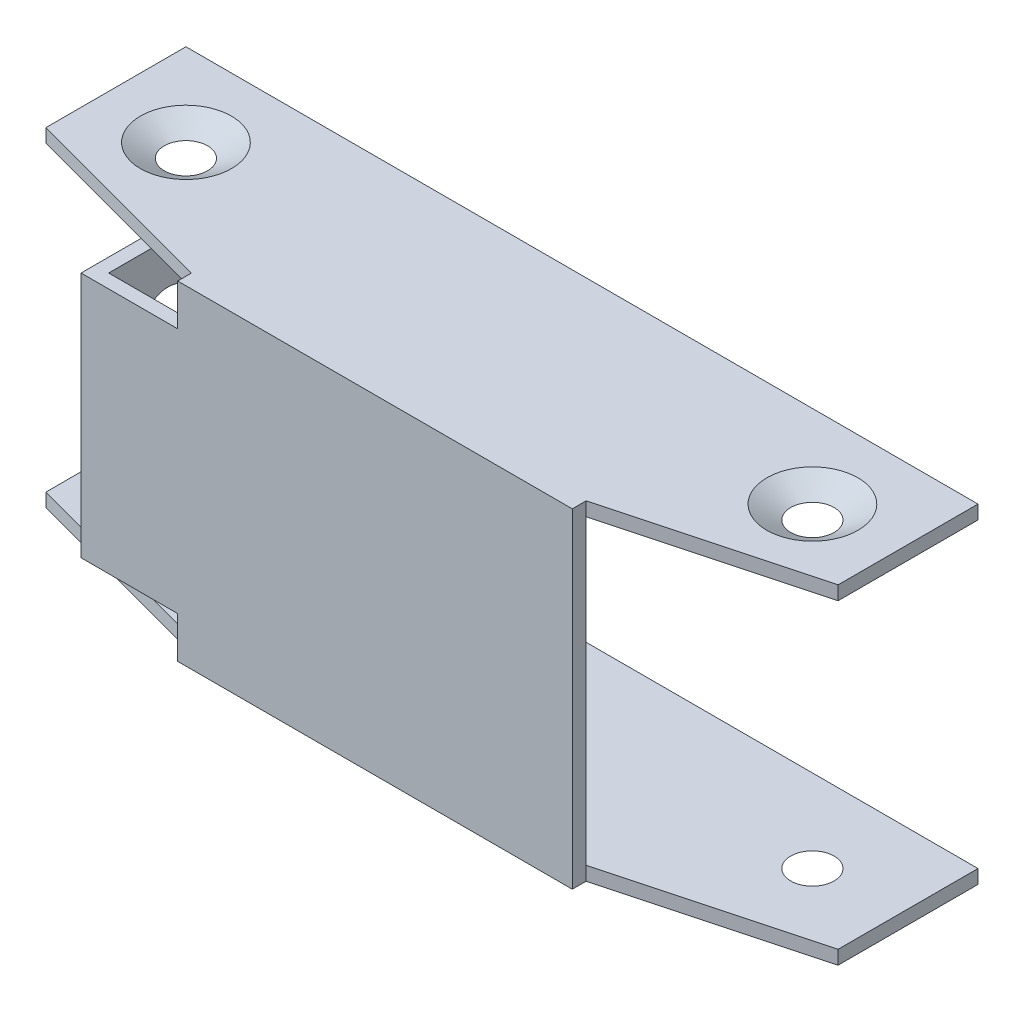
ISO-10303-21;
HEADER;
FILE_DESCRIPTION(('STEP AP214'),'2;1');
FILE_NAME('part.step','',(''),(''),'','','');
FILE_SCHEMA(('AUTOMOTIVE_DESIGN { 1 0 10303 214 1 1 1 1 }'));
ENDSEC;
DATA;
#1=APPLICATION_CONTEXT('core data for automotive mechanical design processes');
#2=APPLICATION_PROTOCOL_DEFINITION('international standard','automotive_design',2000,#1);
#3=PRODUCT_CONTEXT('',#1,'mechanical');
#4=PRODUCT('Part','Part','',(#3));
#5=PRODUCT_RELATED_PRODUCT_CATEGORY('part','',(#4));
#6=PRODUCT_DEFINITION_FORMATION('','',#4);
#7=PRODUCT_DEFINITION_CONTEXT('part definition',#1,'design');
#8=PRODUCT_DEFINITION('design','',#6,#7);
#9=PRODUCT_DEFINITION_SHAPE('','',#8);
#10=(LENGTH_UNIT() NAMED_UNIT(*) SI_UNIT(.MILLI.,.METRE.));
#11=(NAMED_UNIT(*) PLANE_ANGLE_UNIT() SI_UNIT($,.RADIAN.));
#12=(NAMED_UNIT(*) SI_UNIT($,.STERADIAN.) SOLID_ANGLE_UNIT());
#13=UNCERTAINTY_MEASURE_WITH_UNIT(LENGTH_MEASURE(1.E-05),#10,'distance_accuracy_value','');
#14=(GEOMETRIC_REPRESENTATION_CONTEXT(3) GLOBAL_UNCERTAINTY_ASSIGNED_CONTEXT((#13)) GLOBAL_UNIT_ASSIGNED_CONTEXT((#10,
#11,#12)) REPRESENTATION_CONTEXT('',''));
#15=CARTESIAN_POINT('',(0.,0.,0.));
#16=DIRECTION('',(0.,0.,1.));
#17=DIRECTION('',(1.,0.,0.));
#18=AXIS2_PLACEMENT_3D('',#15,#16,#17);
#19=CARTESIAN_POINT('',(36.449,26.51,0.));
#20=DIRECTION('',(0.,-1.,0.));
#21=DIRECTION('',(0.,0.,-1.));
#22=AXIS2_PLACEMENT_3D('',#19,#20,#21);
#23=PLANE('',#22);
#24=DIRECTION('',(0.,0.,1.));
#25=VECTOR('',#24,1.);
#26=CARTESIAN_POINT('',(-18.161,26.51,8.255));
#27=LINE('',#26,#25);
#28=CARTESIAN_POINT('',(-18.161,26.51,8.255));
#29=VERTEX_POINT('',#28);
#30=CARTESIAN_POINT('',(-18.161,26.51,9.525));
#31=VERTEX_POINT('',#30);
#32=EDGE_CURVE('E218',#29,#31,#27,.T.);
#33=ORIENTED_EDGE('',*,*,#32,.F.);
#34=DIRECTION('',(1.,0.,0.));
#35=VECTOR('',#34,1.);
#36=CARTESIAN_POINT('',(-36.449,26.51,8.255));
#37=LINE('',#36,#35);
#38=CARTESIAN_POINT('',(-25.781,26.51,8.255));
#39=VERTEX_POINT('',#38);
#40=EDGE_CURVE('E238',#39,#29,#37,.T.);
#41=ORIENTED_EDGE('',*,*,#40,.F.);
#42=DIRECTION('',(0.,0.,1.));
#43=VECTOR('',#42,1.);
#44=CARTESIAN_POINT('',(-25.781,26.51,-3.175));
#45=LINE('',#44,#43);
#46=CARTESIAN_POINT('',(-25.781,26.51,-3.175));
#47=VERTEX_POINT('',#46);
#48=EDGE_CURVE('E235',#47,#39,#45,.T.);
#49=ORIENTED_EDGE('',*,*,#48,.F.);
#50=DIRECTION('',(1.,0.,0.));
#51=VECTOR('',#50,1.);
#52=CARTESIAN_POINT('',(0.,26.51,-3.175));
#53=LINE('',#52,#51);
#54=CARTESIAN_POINT('',(-27.051,26.51,-3.175));
#55=VERTEX_POINT('',#54);
#56=EDGE_CURVE('E11',#55,#47,#53,.T.);
#57=ORIENTED_EDGE('',*,*,#56,.F.);
#58=DIRECTION('',(0.,0.,-1.));
#59=VECTOR('',#58,1.);
#60=CARTESIAN_POINT('',(-27.051,26.51,0.));
#61=LINE('',#60,#59);
#62=CARTESIAN_POINT('',(-27.051,26.51,9.525));
#63=VERTEX_POINT('',#62);
#64=EDGE_CURVE('E241',#63,#55,#61,.T.);
#65=ORIENTED_EDGE('',*,*,#64,.F.);
#66=DIRECTION('',(-1.,0.,0.));
#67=VECTOR('',#66,1.);
#68=CARTESIAN_POINT('',(36.449,26.51,9.525));
#69=LINE('',#68,#67);
#70=EDGE_CURVE('E233',#31,#63,#69,.T.);
#71=ORIENTED_EDGE('',*,*,#70,.F.);
#72=EDGE_LOOP('',(#33,#41,#49,#57,#65,#71));
#73=FACE_BOUND('',#72,.T.);
#74=ADVANCED_FACE('F35',(#73),#23,.F.);
#75=CARTESIAN_POINT('',(-36.449,31.75,8.255));
#76=DIRECTION('',(0.,0.,1.));
#77=DIRECTION('',(1.,0.,0.));
#78=AXIS2_PLACEMENT_3D('',#75,#76,#77);
#79=PLANE('',#78);
#80=DIRECTION('',(0.,-1.,0.));
#81=VECTOR('',#80,1.);
#82=CARTESIAN_POINT('',(-18.161,30.32,8.255));
#83=LINE('',#82,#81);
#84=CARTESIAN_POINT('',(-18.161,29.05,8.255));
#85=VERTEX_POINT('',#84);
#86=EDGE_CURVE('E58',#85,#29,#83,.T.);
#87=ORIENTED_EDGE('',*,*,#86,.F.);
#88=DIRECTION('',(1.,0.,0.));
#89=VECTOR('',#88,1.);
#90=CARTESIAN_POINT('',(-36.449,29.05,8.255));
#91=LINE('',#90,#89);
#92=CARTESIAN_POINT('',(18.161,29.05,8.255));
#93=VERTEX_POINT('',#92);
#94=EDGE_CURVE('E177',#85,#93,#91,.T.);
#95=ORIENTED_EDGE('',*,*,#94,.T.);
#96=DIRECTION('',(0.,-1.,0.));
#97=VECTOR('',#96,1.);
#98=CARTESIAN_POINT('',(18.161,31.75,8.255));
#99=LINE('',#98,#97);
#100=CARTESIAN_POINT('',(18.161,1.27,8.255));
#101=VERTEX_POINT('',#100);
#102=EDGE_CURVE('E283',#93,#101,#99,.T.);
#103=ORIENTED_EDGE('',*,*,#102,.T.);
#104=DIRECTION('',(-1.,0.,0.));
#105=VECTOR('',#104,1.);
#106=CARTESIAN_POINT('',(-36.449,1.27,8.255));
#107=LINE('',#106,#105);
#108=CARTESIAN_POINT('',(-18.161,1.27,8.255));
#109=VERTEX_POINT('',#108);
#110=EDGE_CURVE('E310',#101,#109,#107,.T.);
#111=ORIENTED_EDGE('',*,*,#110,.T.);
#112=DIRECTION('',(0.,-1.,0.));
#113=VECTOR('',#112,1.);
#114=CARTESIAN_POINT('',(-18.161,31.75,8.255));
#115=LINE('',#114,#113);
#116=CARTESIAN_POINT('',(-18.161,3.81,8.255));
#117=VERTEX_POINT('',#116);
#118=EDGE_CURVE('E301',#117,#109,#115,.T.);
#119=ORIENTED_EDGE('',*,*,#118,.F.);
#120=DIRECTION('',(1.,0.,0.));
#121=VECTOR('',#120,1.);
#122=CARTESIAN_POINT('',(-27.051,3.81,8.255));
#123=LINE('',#122,#121);
#124=CARTESIAN_POINT('',(-25.781,3.81,8.255));
#125=VERTEX_POINT('',#124);
#126=EDGE_CURVE('E276',#125,#117,#123,.T.);
#127=ORIENTED_EDGE('',*,*,#126,.F.);
#128=DIRECTION('',(0.,-1.,0.));
#129=VECTOR('',#128,1.);
#130=CARTESIAN_POINT('',(-25.781,31.75,8.255));
#131=LINE('',#130,#129);
#132=EDGE_CURVE('E255',#39,#125,#131,.T.);
#133=ORIENTED_EDGE('',*,*,#132,.F.);
#134=ORIENTED_EDGE('',*,*,#40,.T.);
#135=EDGE_LOOP('',(#87,#95,#103,#111,#119,#127,#133,#134));
#136=FACE_BOUND('',#135,.T.);
#137=ADVANCED_FACE('F373',(#136),#79,.F.);
#138=CARTESIAN_POINT('',(-18.161,31.75,0.));
#139=DIRECTION('',(1.,0.,0.));
#140=DIRECTION('',(0.,0.,-1.));
#141=AXIS2_PLACEMENT_3D('',#138,#139,#140);
#142=PLANE('',#141);
#143=DIRECTION('',(0.,0.,1.));
#144=VECTOR('',#143,1.);
#145=CARTESIAN_POINT('',(-18.161,3.81,9.525));
#146=LINE('',#145,#144);
#147=CARTESIAN_POINT('',(-18.161,3.81,9.525));
#148=VERTEX_POINT('',#147);
#149=EDGE_CURVE('E265',#117,#148,#146,.T.);
#150=ORIENTED_EDGE('',*,*,#149,.F.);
#151=ORIENTED_EDGE('',*,*,#118,.T.);
#152=CARTESIAN_POINT('',(-18.161,0.,8.255));
#153=VERTEX_POINT('',#152);
#154=EDGE_CURVE('E295',#109,#153,#115,.T.);
#155=ORIENTED_EDGE('',*,*,#154,.T.);
#156=DIRECTION('',(0.,0.,-1.));
#157=VECTOR('',#156,1.);
#158=CARTESIAN_POINT('',(-18.161,0.,0.));
#159=LINE('',#158,#157);
#160=CARTESIAN_POINT('',(-18.161,0.,9.525));
#161=VERTEX_POINT('',#160);
#162=EDGE_CURVE('E298',#161,#153,#159,.T.);
#163=ORIENTED_EDGE('',*,*,#162,.F.);
#164=DIRECTION('',(0.,-1.,0.));
#165=VECTOR('',#164,1.);
#166=CARTESIAN_POINT('',(-18.161,31.75,9.525));
#167=LINE('',#166,#165);
#168=EDGE_CURVE('E299',#148,#161,#167,.T.);
#169=ORIENTED_EDGE('',*,*,#168,.F.);
#170=EDGE_LOOP('',(#150,#151,#155,#163,#169));
#171=FACE_BOUND('',#170,.T.);
#172=ADVANCED_FACE('F378',(#171),#142,.F.);
#173=CARTESIAN_POINT('',(36.449,1.27,0.));
#174=DIRECTION('',(1.,0.,0.));
#175=DIRECTION('',(0.,0.,-1.));
#176=AXIS2_PLACEMENT_3D('',#173,#174,#175);
#177=PLANE('',#176);
#178=DIRECTION('',(0.,0.,1.));
#179=VECTOR('',#178,1.);
#180=CARTESIAN_POINT('',(36.449,1.27,0.));
#181=LINE('',#180,#179);
#182=CARTESIAN_POINT('',(36.449,1.27,-9.525));
#183=VERTEX_POINT('',#182);
#184=CARTESIAN_POINT('',(36.449,1.27,3.35474516881961));
#185=VERTEX_POINT('',#184);
#186=EDGE_CURVE('E326',#183,#185,#181,.T.);
#187=ORIENTED_EDGE('',*,*,#186,.T.);
#188=DIRECTION('',(0.,-1.,0.));
#189=VECTOR('',#188,1.);
#190=CARTESIAN_POINT('',(36.449,31.75,3.35474516881961));
#191=LINE('',#190,#189);
#192=CARTESIAN_POINT('',(36.449,0.,3.35474516881961));
#193=VERTEX_POINT('',#192);
#194=EDGE_CURVE('E278',#185,#193,#191,.T.);
#195=ORIENTED_EDGE('',*,*,#194,.T.);
#196=DIRECTION('',(0.,0.,1.));
#197=VECTOR('',#196,1.);
#198=CARTESIAN_POINT('',(36.449,0.,0.));
#199=LINE('',#198,#197);
#200=CARTESIAN_POINT('',(36.449,0.,-9.525));
#201=VERTEX_POINT('',#200);
#202=EDGE_CURVE('E325',#201,#193,#199,.T.);
#203=ORIENTED_EDGE('',*,*,#202,.F.);
#204=DIRECTION('',(0.,-1.,0.));
#205=VECTOR('',#204,1.);
#206=CARTESIAN_POINT('',(36.449,1.27,-9.525));
#207=LINE('',#206,#205);
#208=EDGE_CURVE('E43',#183,#201,#207,.T.);
#209=ORIENTED_EDGE('',*,*,#208,.F.);
#210=EDGE_LOOP('',(#187,#195,#203,#209));
#211=FACE_BOUND('',#210,.T.);
#212=ADVANCED_FACE('F37',(#211),#177,.T.);
#213=CARTESIAN_POINT('',(0.,1.27,9.525));
#214=DIRECTION('',(0.,0.,-1.));
#215=DIRECTION('',(-1.,0.,0.));
#216=AXIS2_PLACEMENT_3D('',#213,#214,#215);
#217=PLANE('',#216);
#218=DIRECTION('',(1.,0.,0.));
#219=VECTOR('',#218,1.);
#220=CARTESIAN_POINT('',(0.,0.,9.525));
#221=LINE('',#220,#219);
#222=CARTESIAN_POINT('',(18.161,0.,9.525));
#223=VERTEX_POINT('',#222);
#224=EDGE_CURVE('E330',#161,#223,#221,.T.);
#225=ORIENTED_EDGE('',*,*,#224,.T.);
#226=DIRECTION('',(0.,-1.,0.));
#227=VECTOR('',#226,1.);
#228=CARTESIAN_POINT('',(18.161,31.75,9.525));
#229=LINE('',#228,#227);
#230=CARTESIAN_POINT('',(18.161,30.32,9.525));
#231=VERTEX_POINT('',#230);
#232=EDGE_CURVE('E285',#231,#223,#229,.T.);
#233=ORIENTED_EDGE('',*,*,#232,.F.);
#234=DIRECTION('',(1.,0.,0.));
#235=VECTOR('',#234,1.);
#236=CARTESIAN_POINT('',(-18.161,30.32,9.525));
#237=LINE('',#236,#235);
#238=CARTESIAN_POINT('',(-18.161,30.32,9.525));
#239=VERTEX_POINT('',#238);
#240=EDGE_CURVE('E222',#239,#231,#237,.T.);
#241=ORIENTED_EDGE('',*,*,#240,.F.);
#242=DIRECTION('',(0.,-1.,0.));
#243=VECTOR('',#242,1.);
#244=CARTESIAN_POINT('',(-18.161,30.32,9.525));
#245=LINE('',#244,#243);
#246=EDGE_CURVE('E231',#239,#31,#245,.T.);
#247=ORIENTED_EDGE('',*,*,#246,.T.);
#248=ORIENTED_EDGE('',*,*,#70,.T.);
#249=DIRECTION('',(0.,1.,0.));
#250=VECTOR('',#249,1.);
#251=CARTESIAN_POINT('',(-27.051,31.75,9.525));
#252=LINE('',#251,#250);
#253=CARTESIAN_POINT('',(-27.051,3.81,9.525));
#254=VERTEX_POINT('',#253);
#255=EDGE_CURVE('E266',#254,#63,#252,.T.);
#256=ORIENTED_EDGE('',*,*,#255,.F.);
#257=DIRECTION('',(1.,0.,0.));
#258=VECTOR('',#257,1.);
#259=CARTESIAN_POINT('',(-27.051,3.81,9.525));
#260=LINE('',#259,#258);
#261=EDGE_CURVE('E271',#254,#148,#260,.T.);
#262=ORIENTED_EDGE('',*,*,#261,.T.);
#263=ORIENTED_EDGE('',*,*,#168,.T.);
#264=EDGE_LOOP('',(#225,#233,#241,#247,#248,#256,#262,#263));
#265=FACE_BOUND('',#264,.T.);
#266=ADVANCED_FACE('F435',(#265),#217,.F.);
#267=CARTESIAN_POINT('',(0.,1.27,0.));
#268=DIRECTION('',(0.,1.,0.));
#269=DIRECTION('',(0.,0.,1.));
#270=AXIS2_PLACEMENT_3D('',#267,#268,#269);
#271=PLANE('',#270);
#272=CARTESIAN_POINT('',(-28.829,1.27,-1.90500000000002));
#273=DIRECTION('',(0.,1.,0.));
#274=DIRECTION('',(0.,0.,1.));
#275=AXIS2_PLACEMENT_3D('',#272,#273,#274);
#276=CIRCLE('',#275,1.99129547438752);
#277=CARTESIAN_POINT('',(-28.829,1.27,0.0862954743874901));
#278=VERTEX_POINT('',#277);
#279=EDGE_CURVE('E322',#278,#278,#276,.T.);
#280=ORIENTED_EDGE('',*,*,#279,.F.);
#281=EDGE_LOOP('',(#280));
#282=FACE_BOUND('',#281,.T.);
#283=CARTESIAN_POINT('',(28.829,1.27,-1.90500000000002));
#284=DIRECTION('',(0.,1.,0.));
#285=DIRECTION('',(0.,0.,1.));
#286=AXIS2_PLACEMENT_3D('',#283,#284,#285);
#287=CIRCLE('',#286,1.99129547438753);
#288=CARTESIAN_POINT('',(28.829,1.27,0.0862954743875086));
#289=VERTEX_POINT('',#288);
#290=EDGE_CURVE('E317',#289,#289,#287,.T.);
#291=ORIENTED_EDGE('',*,*,#290,.F.);
#292=EDGE_LOOP('',(#291));
#293=FACE_BOUND('',#292,.T.);
#294=ORIENTED_EDGE('',*,*,#110,.F.);
#295=DIRECTION('',(0.965925826289068,0.,-0.258819045102522));
#296=VECTOR('',#295,1.);
#297=CARTESIAN_POINT('',(3.28030632093542,1.27,12.2422698541203));
#298=LINE('',#297,#296);
#299=EDGE_CURVE('E292',#101,#185,#298,.T.);
#300=ORIENTED_EDGE('',*,*,#299,.T.);
#301=ORIENTED_EDGE('',*,*,#186,.F.);
#302=DIRECTION('',(1.,0.,0.));
#303=VECTOR('',#302,1.);
#304=CARTESIAN_POINT('',(0.,1.27,-9.525));
#305=LINE('',#304,#303);
#306=CARTESIAN_POINT('',(-36.449,1.27,-9.525));
#307=VERTEX_POINT('',#306);
#308=EDGE_CURVE('E329',#307,#183,#305,.T.);
#309=ORIENTED_EDGE('',*,*,#308,.F.);
#310=DIRECTION('',(0.,0.,1.));
#311=VECTOR('',#310,1.);
#312=CARTESIAN_POINT('',(-36.449,1.27,0.));
#313=LINE('',#312,#311);
#314=CARTESIAN_POINT('',(-36.449,1.27,3.35474516881961));
#315=VERTEX_POINT('',#314);
#316=EDGE_CURVE('E333',#307,#315,#313,.T.);
#317=ORIENTED_EDGE('',*,*,#316,.T.);
#318=DIRECTION('',(-0.965925826289068,0.,-0.258819045102522));
#319=VECTOR('',#318,1.);
#320=CARTESIAN_POINT('',(-3.28030632093542,1.27,12.2422698541203));
#321=LINE('',#320,#319);
#322=EDGE_CURVE('E308',#109,#315,#321,.T.);
#323=ORIENTED_EDGE('',*,*,#322,.F.);
#324=EDGE_LOOP('',(#294,#300,#301,#309,#317,#323));
#325=FACE_BOUND('',#324,.T.);
#326=ADVANCED_FACE('F461',(#282,#293,#325),#271,.T.);
#327=CARTESIAN_POINT('',(0.,0.,0.));
#328=DIRECTION('',(0.,1.,0.));
#329=DIRECTION('',(0.,0.,1.));
#330=AXIS2_PLACEMENT_3D('',#327,#328,#329);
#331=PLANE('',#330);
#332=CARTESIAN_POINT('',(28.829,0.,-1.90500000000002));
#333=DIRECTION('',(0.,-1.,0.));
#334=DIRECTION('',(0.,0.,-1.));
#335=AXIS2_PLACEMENT_3D('',#332,#333,#334);
#336=CIRCLE('',#335,4.19100000000001);
#337=CARTESIAN_POINT('',(28.829,0.,-6.09600000000003));
#338=VERTEX_POINT('',#337);
#339=EDGE_CURVE('E313',#338,#338,#336,.T.);
#340=ORIENTED_EDGE('',*,*,#339,.F.);
#341=EDGE_LOOP('',(#340));
#342=FACE_BOUND('',#341,.T.);
#343=CARTESIAN_POINT('',(-28.829,0.,-1.90500000000002));
#344=DIRECTION('',(0.,-1.,0.));
#345=DIRECTION('',(0.,0.,-1.));
#346=AXIS2_PLACEMENT_3D('',#343,#344,#345);
#347=CIRCLE('',#346,4.191);
#348=CARTESIAN_POINT('',(-28.829,0.,-6.09600000000003));
#349=VERTEX_POINT('',#348);
#350=EDGE_CURVE('E314',#349,#349,#347,.T.);
#351=ORIENTED_EDGE('',*,*,#350,.F.);
#352=EDGE_LOOP('',(#351));
#353=FACE_BOUND('',#352,.T.);
#354=DIRECTION('',(0.965925826289068,0.,-0.258819045102522));
#355=VECTOR('',#354,1.);
#356=CARTESIAN_POINT('',(3.28030632093542,0.,12.2422698541203));
#357=LINE('',#356,#355);
#358=CARTESIAN_POINT('',(18.161,0.,8.255));
#359=VERTEX_POINT('',#358);
#360=EDGE_CURVE('E290',#359,#193,#357,.T.);
#361=ORIENTED_EDGE('',*,*,#360,.F.);
#362=DIRECTION('',(0.,0.,-1.));
#363=VECTOR('',#362,1.);
#364=CARTESIAN_POINT('',(18.161,0.,0.));
#365=LINE('',#364,#363);
#366=EDGE_CURVE('E282',#223,#359,#365,.T.);
#367=ORIENTED_EDGE('',*,*,#366,.F.);
#368=ORIENTED_EDGE('',*,*,#224,.F.);
#369=ORIENTED_EDGE('',*,*,#162,.T.);
#370=DIRECTION('',(-0.965925826289068,0.,-0.258819045102522));
#371=VECTOR('',#370,1.);
#372=CARTESIAN_POINT('',(-3.28030632093542,0.,12.2422698541203));
#373=LINE('',#372,#371);
#374=CARTESIAN_POINT('',(-36.449,0.,3.35474516881961));
#375=VERTEX_POINT('',#374);
#376=EDGE_CURVE('E305',#153,#375,#373,.T.);
#377=ORIENTED_EDGE('',*,*,#376,.T.);
#378=DIRECTION('',(0.,0.,1.));
#379=VECTOR('',#378,1.);
#380=CARTESIAN_POINT('',(-36.449,0.,0.));
#381=LINE('',#380,#379);
#382=CARTESIAN_POINT('',(-36.449,0.,-9.525));
#383=VERTEX_POINT('',#382);
#384=EDGE_CURVE('E342',#383,#375,#381,.T.);
#385=ORIENTED_EDGE('',*,*,#384,.F.);
#386=DIRECTION('',(1.,0.,0.));
#387=VECTOR('',#386,1.);
#388=CARTESIAN_POINT('',(0.,0.,-9.525));
#389=LINE('',#388,#387);
#390=EDGE_CURVE('E339',#383,#201,#389,.T.);
#391=ORIENTED_EDGE('',*,*,#390,.T.);
#392=ORIENTED_EDGE('',*,*,#202,.T.);
#393=EDGE_LOOP('',(#361,#367,#368,#369,#377,#385,#391,#392));
#394=FACE_BOUND('',#393,.T.);
#395=ADVANCED_FACE('F470',(#342,#353,#394),#331,.F.);
#396=CARTESIAN_POINT('',(0.,1.27,-9.525));
#397=DIRECTION('',(0.,0.,-1.));
#398=DIRECTION('',(-1.,0.,0.));
#399=AXIS2_PLACEMENT_3D('',#396,#397,#398);
#400=PLANE('',#399);
#401=ORIENTED_EDGE('',*,*,#390,.F.);
#402=DIRECTION('',(0.,-1.,0.));
#403=VECTOR('',#402,1.);
#404=CARTESIAN_POINT('',(-36.449,1.27,-9.525));
#405=LINE('',#404,#403);
#406=EDGE_CURVE('E336',#307,#383,#405,.T.);
#407=ORIENTED_EDGE('',*,*,#406,.F.);
#408=ORIENTED_EDGE('',*,*,#308,.T.);
#409=ORIENTED_EDGE('',*,*,#208,.T.);
#410=EDGE_LOOP('',(#401,#407,#408,#409));
#411=FACE_BOUND('',#410,.T.);
#412=ADVANCED_FACE('F491',(#411),#400,.T.);
#413=CARTESIAN_POINT('',(-36.449,1.27,0.));
#414=DIRECTION('',(1.,0.,0.));
#415=DIRECTION('',(0.,0.,-1.));
#416=AXIS2_PLACEMENT_3D('',#413,#414,#415);
#417=PLANE('',#416);
#418=ORIENTED_EDGE('',*,*,#384,.T.);
#419=DIRECTION('',(0.,-1.,0.));
#420=VECTOR('',#419,1.);
#421=CARTESIAN_POINT('',(-36.449,31.75,3.35474516881961));
#422=LINE('',#421,#420);
#423=EDGE_CURVE('E296',#315,#375,#422,.T.);
#424=ORIENTED_EDGE('',*,*,#423,.F.);
#425=ORIENTED_EDGE('',*,*,#316,.F.);
#426=ORIENTED_EDGE('',*,*,#406,.T.);
#427=EDGE_LOOP('',(#418,#424,#425,#426));
#428=FACE_BOUND('',#427,.T.);
#429=ADVANCED_FACE('F466',(#428),#417,.F.);
#430=CARTESIAN_POINT('',(28.829,0.,-1.90500000000002));
#431=DIRECTION('',(0.,-1.,0.));
#432=DIRECTION('',(0.,0.,-1.));
#433=AXIS2_PLACEMENT_3D('',#430,#431,#432);
#434=CONICAL_SURFACE('',#433,4.19100000000001,1.0471975511966);
#435=ORIENTED_EDGE('',*,*,#290,.T.);
#436=EDGE_LOOP('',(#435));
#437=FACE_BOUND('',#436,.T.);
#438=ORIENTED_EDGE('',*,*,#339,.T.);
#439=EDGE_LOOP('',(#438));
#440=FACE_BOUND('',#439,.T.);
#441=ADVANCED_FACE('F497',(#437,#440),#434,.F.);
#442=CARTESIAN_POINT('',(-28.829,0.,-1.90500000000002));
#443=DIRECTION('',(0.,-1.,0.));
#444=DIRECTION('',(0.,0.,-1.));
#445=AXIS2_PLACEMENT_3D('',#442,#443,#444);
#446=CONICAL_SURFACE('',#445,4.191,1.0471975511966);
#447=ORIENTED_EDGE('',*,*,#279,.T.);
#448=EDGE_LOOP('',(#447));
#449=FACE_BOUND('',#448,.T.);
#450=ORIENTED_EDGE('',*,*,#350,.T.);
#451=EDGE_LOOP('',(#450));
#452=FACE_BOUND('',#451,.T.);
#453=ADVANCED_FACE('F509',(#449,#452),#446,.F.);
#454=CARTESIAN_POINT('',(-3.28030632093542,31.75,12.2422698541203));
#455=DIRECTION('',(0.258819045102522,0.,-0.965925826289068));
#456=DIRECTION('',(-0.965925826289068,0.,-0.258819045102522));
#457=AXIS2_PLACEMENT_3D('',#454,#455,#456);
#458=PLANE('',#457);
#459=ORIENTED_EDGE('',*,*,#322,.T.);
#460=ORIENTED_EDGE('',*,*,#423,.T.);
#461=ORIENTED_EDGE('',*,*,#376,.F.);
#462=ORIENTED_EDGE('',*,*,#154,.F.);
#463=EDGE_LOOP('',(#459,#460,#461,#462));
#464=FACE_BOUND('',#463,.T.);
#465=ADVANCED_FACE('F459',(#464),#458,.F.);
#466=CARTESIAN_POINT('',(3.28030632093542,31.75,12.2422698541203));
#467=DIRECTION('',(0.258819045102522,0.,0.965925826289068));
#468=DIRECTION('',(0.965925826289068,0.,-0.258819045102522));
#469=AXIS2_PLACEMENT_3D('',#466,#467,#468);
#470=PLANE('',#469);
#471=EDGE_CURVE('E284',#101,#359,#99,.T.);
#472=ORIENTED_EDGE('',*,*,#471,.T.);
#473=ORIENTED_EDGE('',*,*,#360,.T.);
#474=ORIENTED_EDGE('',*,*,#194,.F.);
#475=ORIENTED_EDGE('',*,*,#299,.F.);
#476=EDGE_LOOP('',(#472,#473,#474,#475));
#477=FACE_BOUND('',#476,.T.);
#478=ADVANCED_FACE('F487',(#477),#470,.T.);
#479=CARTESIAN_POINT('',(18.161,31.75,0.));
#480=DIRECTION('',(1.,0.,0.));
#481=DIRECTION('',(0.,0.,-1.));
#482=AXIS2_PLACEMENT_3D('',#479,#480,#481);
#483=PLANE('',#482);
#484=ORIENTED_EDGE('',*,*,#102,.F.);
#485=CARTESIAN_POINT('',(18.161,30.32,8.255));
#486=VERTEX_POINT('',#485);
#487=EDGE_CURVE('E279',#486,#93,#99,.T.);
#488=ORIENTED_EDGE('',*,*,#487,.F.);
#489=DIRECTION('',(0.,0.,-1.));
#490=VECTOR('',#489,1.);
#491=CARTESIAN_POINT('',(18.161,30.32,8.255));
#492=LINE('',#491,#490);
#493=EDGE_CURVE('E225',#231,#486,#492,.T.);
#494=ORIENTED_EDGE('',*,*,#493,.F.);
#495=ORIENTED_EDGE('',*,*,#232,.T.);
#496=ORIENTED_EDGE('',*,*,#366,.T.);
#497=ORIENTED_EDGE('',*,*,#471,.F.);
#498=EDGE_LOOP('',(#484,#488,#494,#495,#496,#497));
#499=FACE_BOUND('',#498,.T.);
#500=ADVANCED_FACE('F475',(#499),#483,.T.);
#501=CARTESIAN_POINT('',(-27.051,3.81,9.525));
#502=DIRECTION('',(0.,1.,0.));
#503=DIRECTION('',(0.,0.,1.));
#504=AXIS2_PLACEMENT_3D('',#501,#502,#503);
#505=PLANE('',#504);
#506=ORIENTED_EDGE('',*,*,#149,.T.);
#507=ORIENTED_EDGE('',*,*,#261,.F.);
#508=DIRECTION('',(0.,0.,1.));
#509=VECTOR('',#508,1.);
#510=CARTESIAN_POINT('',(-27.051,3.81,9.525));
#511=LINE('',#510,#509);
#512=CARTESIAN_POINT('',(-27.051,3.81,-3.175));
#513=VERTEX_POINT('',#512);
#514=EDGE_CURVE('E269',#513,#254,#511,.T.);
#515=ORIENTED_EDGE('',*,*,#514,.F.);
#516=DIRECTION('',(-1.,0.,0.));
#517=VECTOR('',#516,1.);
#518=CARTESIAN_POINT('',(-27.051,3.81,-3.175));
#519=LINE('',#518,#517);
#520=CARTESIAN_POINT('',(-25.781,3.81,-3.175));
#521=VERTEX_POINT('',#520);
#522=EDGE_CURVE('E257',#521,#513,#519,.T.);
#523=ORIENTED_EDGE('',*,*,#522,.F.);
#524=DIRECTION('',(0.,0.,1.));
#525=VECTOR('',#524,1.);
#526=CARTESIAN_POINT('',(-25.781,3.81,-3.175));
#527=LINE('',#526,#525);
#528=EDGE_CURVE('E260',#521,#125,#527,.T.);
#529=ORIENTED_EDGE('',*,*,#528,.T.);
#530=ORIENTED_EDGE('',*,*,#126,.T.);
#531=EDGE_LOOP('',(#506,#507,#515,#523,#529,#530));
#532=FACE_BOUND('',#531,.T.);
#533=ADVANCED_FACE('F444',(#532),#505,.F.);
#534=CARTESIAN_POINT('',(-27.051,0.,0.));
#535=DIRECTION('',(1.,0.,0.));
#536=DIRECTION('',(0.,0.,-1.));
#537=AXIS2_PLACEMENT_3D('',#534,#535,#536);
#538=PLANE('',#537);
#539=CARTESIAN_POINT('',(-27.051,10.16,2.77876));
#540=DIRECTION('',(-1.,0.,0.));
#541=DIRECTION('',(0.,0.,1.));
#542=AXIS2_PLACEMENT_3D('',#539,#540,#541);
#543=CIRCLE('',#542,2.5);
#544=CARTESIAN_POINT('',(-27.051,10.16,5.27876));
#545=VERTEX_POINT('',#544);
#546=EDGE_CURVE('E245',#545,#545,#543,.T.);
#547=ORIENTED_EDGE('',*,*,#546,.F.);
#548=EDGE_LOOP('',(#547));
#549=FACE_BOUND('',#548,.T.);
#550=CARTESIAN_POINT('',(-27.051,20.16,2.77876));
#551=DIRECTION('',(-1.,0.,0.));
#552=DIRECTION('',(0.,0.,1.));
#553=AXIS2_PLACEMENT_3D('',#550,#551,#552);
#554=CIRCLE('',#553,2.5);
#555=CARTESIAN_POINT('',(-27.051,20.16,5.27876));
#556=VERTEX_POINT('',#555);
#557=EDGE_CURVE('E244',#556,#556,#554,.T.);
#558=ORIENTED_EDGE('',*,*,#557,.F.);
#559=EDGE_LOOP('',(#558));
#560=FACE_BOUND('',#559,.T.);
#561=ORIENTED_EDGE('',*,*,#255,.T.);
#562=ORIENTED_EDGE('',*,*,#64,.T.);
#563=DIRECTION('',(0.,1.,0.));
#564=VECTOR('',#563,1.);
#565=CARTESIAN_POINT('',(-27.051,31.75,-3.175));
#566=LINE('',#565,#564);
#567=EDGE_CURVE('E251',#513,#55,#566,.T.);
#568=ORIENTED_EDGE('',*,*,#567,.F.);
#569=ORIENTED_EDGE('',*,*,#514,.T.);
#570=EDGE_LOOP('',(#561,#562,#568,#569));
#571=FACE_BOUND('',#570,.T.);
#572=ADVANCED_FACE('F440',(#549,#560,#571),#538,.F.);
#573=CARTESIAN_POINT('',(-25.781,31.75,-3.175));
#574=DIRECTION('',(-1.,0.,0.));
#575=DIRECTION('',(0.,-1.,0.));
#576=AXIS2_PLACEMENT_3D('',#573,#574,#575);
#577=PLANE('',#576);
#578=CARTESIAN_POINT('',(-25.781,10.16,2.77876));
#579=DIRECTION('',(-1.,0.,0.));
#580=DIRECTION('',(0.,-1.,0.));
#581=AXIS2_PLACEMENT_3D('',#578,#579,#580);
#582=CIRCLE('',#581,2.5);
#583=CARTESIAN_POINT('',(-25.781,7.66,2.77876));
#584=VERTEX_POINT('',#583);
#585=EDGE_CURVE('E262',#584,#584,#582,.T.);
#586=ORIENTED_EDGE('',*,*,#585,.T.);
#587=EDGE_LOOP('',(#586));
#588=FACE_BOUND('',#587,.T.);
#589=CARTESIAN_POINT('',(-25.781,20.16,2.77876));
#590=DIRECTION('',(-1.,0.,0.));
#591=DIRECTION('',(0.,-1.,0.));
#592=AXIS2_PLACEMENT_3D('',#589,#590,#591);
#593=CIRCLE('',#592,2.5);
#594=CARTESIAN_POINT('',(-25.781,17.66,2.77876));
#595=VERTEX_POINT('',#594);
#596=EDGE_CURVE('E248',#595,#595,#593,.T.);
#597=ORIENTED_EDGE('',*,*,#596,.T.);
#598=EDGE_LOOP('',(#597));
#599=FACE_BOUND('',#598,.T.);
#600=DIRECTION('',(0.,-1.,0.));
#601=VECTOR('',#600,1.);
#602=CARTESIAN_POINT('',(-25.781,31.75,-3.175));
#603=LINE('',#602,#601);
#604=EDGE_CURVE('E254',#47,#521,#603,.T.);
#605=ORIENTED_EDGE('',*,*,#604,.F.);
#606=ORIENTED_EDGE('',*,*,#48,.T.);
#607=ORIENTED_EDGE('',*,*,#132,.T.);
#608=ORIENTED_EDGE('',*,*,#528,.F.);
#609=EDGE_LOOP('',(#605,#606,#607,#608));
#610=FACE_BOUND('',#609,.T.);
#611=ADVANCED_FACE('F353',(#588,#599,#610),#577,.F.);
#612=CARTESIAN_POINT('',(0.,0.,-3.175));
#613=DIRECTION('',(0.,0.,1.));
#614=DIRECTION('',(1.,0.,0.));
#615=AXIS2_PLACEMENT_3D('',#612,#613,#614);
#616=PLANE('',#615);
#617=ORIENTED_EDGE('',*,*,#567,.T.);
#618=ORIENTED_EDGE('',*,*,#56,.T.);
#619=ORIENTED_EDGE('',*,*,#604,.T.);
#620=ORIENTED_EDGE('',*,*,#522,.T.);
#621=EDGE_LOOP('',(#617,#618,#619,#620));
#622=FACE_BOUND('',#621,.T.);
#623=ADVANCED_FACE('F368',(#622),#616,.F.);
#624=CARTESIAN_POINT('',(36.449,20.16,2.77876));
#625=DIRECTION('',(-1.,0.,0.));
#626=DIRECTION('',(0.,0.,1.));
#627=AXIS2_PLACEMENT_3D('',#624,#625,#626);
#628=CYLINDRICAL_SURFACE('',#627,2.5);
#629=ORIENTED_EDGE('',*,*,#557,.T.);
#630=EDGE_LOOP('',(#629));
#631=FACE_BOUND('',#630,.T.);
#632=ORIENTED_EDGE('',*,*,#596,.F.);
#633=EDGE_LOOP('',(#632));
#634=FACE_BOUND('',#633,.T.);
#635=ADVANCED_FACE('F359',(#631,#634),#628,.F.);
#636=CARTESIAN_POINT('',(36.449,10.16,2.77876));
#637=DIRECTION('',(-1.,0.,0.));
#638=DIRECTION('',(0.,0.,1.));
#639=AXIS2_PLACEMENT_3D('',#636,#637,#638);
#640=CYLINDRICAL_SURFACE('',#639,2.5);
#641=ORIENTED_EDGE('',*,*,#546,.T.);
#642=EDGE_LOOP('',(#641));
#643=FACE_BOUND('',#642,.T.);
#644=ORIENTED_EDGE('',*,*,#585,.F.);
#645=EDGE_LOOP('',(#644));
#646=FACE_BOUND('',#645,.T.);
#647=ADVANCED_FACE('F356',(#643,#646),#640,.F.);
#648=CARTESIAN_POINT('',(-18.161,30.32,8.255));
#649=DIRECTION('',(1.,0.,0.));
#650=DIRECTION('',(0.,0.,-1.));
#651=AXIS2_PLACEMENT_3D('',#648,#649,#650);
#652=PLANE('',#651);
#653=ORIENTED_EDGE('',*,*,#32,.T.);
#654=ORIENTED_EDGE('',*,*,#246,.F.);
#655=DIRECTION('',(0.,0.,1.));
#656=VECTOR('',#655,1.);
#657=CARTESIAN_POINT('',(-18.161,30.32,8.255));
#658=LINE('',#657,#656);
#659=CARTESIAN_POINT('',(-18.161,30.32,8.255));
#660=VERTEX_POINT('',#659);
#661=EDGE_CURVE('E219',#660,#239,#658,.T.);
#662=ORIENTED_EDGE('',*,*,#661,.F.);
#663=EDGE_CURVE('E229',#660,#85,#83,.T.);
#664=ORIENTED_EDGE('',*,*,#663,.T.);
#665=ORIENTED_EDGE('',*,*,#86,.T.);
#666=EDGE_LOOP('',(#653,#654,#662,#664,#665));
#667=FACE_BOUND('',#666,.T.);
#668=ADVANCED_FACE('F358',(#667),#652,.F.);
#669=CARTESIAN_POINT('',(0.,30.32,0.));
#670=DIRECTION('',(0.,1.,0.));
#671=DIRECTION('',(0.,0.,1.));
#672=AXIS2_PLACEMENT_3D('',#669,#670,#671);
#673=PLANE('',#672);
#674=CARTESIAN_POINT('',(-28.829,30.32,-1.90500000000002));
#675=DIRECTION('',(0.,1.,0.));
#676=DIRECTION('',(0.,0.,1.));
#677=AXIS2_PLACEMENT_3D('',#674,#675,#676);
#678=CIRCLE('',#677,4.191);
#679=CARTESIAN_POINT('',(-28.829,30.32,2.28599999999998));
#680=VERTEX_POINT('',#679);
#681=EDGE_CURVE('E418',#680,#680,#678,.T.);
#682=ORIENTED_EDGE('',*,*,#681,.F.);
#683=EDGE_LOOP('',(#682));
#684=FACE_BOUND('',#683,.T.);
#685=CARTESIAN_POINT('',(28.829,30.32,-1.90500000000002));
#686=DIRECTION('',(0.,1.,0.));
#687=DIRECTION('',(0.,0.,1.));
#688=AXIS2_PLACEMENT_3D('',#685,#686,#687);
#689=CIRCLE('',#688,4.19100000000001);
#690=CARTESIAN_POINT('',(28.829,30.32,2.28599999999999));
#691=VERTEX_POINT('',#690);
#692=EDGE_CURVE('E423',#691,#691,#689,.T.);
#693=ORIENTED_EDGE('',*,*,#692,.F.);
#694=EDGE_LOOP('',(#693));
#695=FACE_BOUND('',#694,.T.);
#696=ORIENTED_EDGE('',*,*,#661,.T.);
#697=ORIENTED_EDGE('',*,*,#240,.T.);
#698=ORIENTED_EDGE('',*,*,#493,.T.);
#699=DIRECTION('',(-0.965925826289068,0.,0.258819045102522));
#700=VECTOR('',#699,1.);
#701=CARTESIAN_POINT('',(3.28030632093542,30.32,12.2422698541203));
#702=LINE('',#701,#700);
#703=CARTESIAN_POINT('',(36.449,30.32,3.3547451688196));
#704=VERTEX_POINT('',#703);
#705=EDGE_CURVE('E178',#704,#486,#702,.T.);
#706=ORIENTED_EDGE('',*,*,#705,.F.);
#707=DIRECTION('',(0.,0.,1.));
#708=VECTOR('',#707,1.);
#709=CARTESIAN_POINT('',(36.449,30.32,0.));
#710=LINE('',#709,#708);
#711=CARTESIAN_POINT('',(36.449,30.32,-9.525));
#712=VERTEX_POINT('',#711);
#713=EDGE_CURVE('E208',#712,#704,#710,.T.);
#714=ORIENTED_EDGE('',*,*,#713,.F.);
#715=DIRECTION('',(1.,0.,0.));
#716=VECTOR('',#715,1.);
#717=CARTESIAN_POINT('',(0.,30.32,-9.525));
#718=LINE('',#717,#716);
#719=CARTESIAN_POINT('',(-36.449,30.32,-9.525));
#720=VERTEX_POINT('',#719);
#721=EDGE_CURVE('E206',#720,#712,#718,.T.);
#722=ORIENTED_EDGE('',*,*,#721,.F.);
#723=DIRECTION('',(0.,0.,-1.));
#724=VECTOR('',#723,1.);
#725=CARTESIAN_POINT('',(-36.449,30.32,0.));
#726=LINE('',#725,#724);
#727=CARTESIAN_POINT('',(-36.449,30.32,3.3547451688196));
#728=VERTEX_POINT('',#727);
#729=EDGE_CURVE('E203',#728,#720,#726,.T.);
#730=ORIENTED_EDGE('',*,*,#729,.F.);
#731=DIRECTION('',(-0.965925826289068,0.,-0.258819045102522));
#732=VECTOR('',#731,1.);
#733=CARTESIAN_POINT('',(-3.28030632093542,30.32,12.2422698541203));
#734=LINE('',#733,#732);
#735=EDGE_CURVE('E184',#660,#728,#734,.T.);
#736=ORIENTED_EDGE('',*,*,#735,.F.);
#737=EDGE_LOOP('',(#696,#697,#698,#706,#714,#722,#730,#736));
#738=FACE_BOUND('',#737,.T.);
#739=ADVANCED_FACE('F366',(#684,#695,#738),#673,.T.);
#740=CARTESIAN_POINT('',(0.,29.05,0.));
#741=DIRECTION('',(0.,-1.,0.));
#742=DIRECTION('',(0.,0.,-1.));
#743=AXIS2_PLACEMENT_3D('',#740,#741,#742);
#744=PLANE('',#743);
#745=CARTESIAN_POINT('',(-28.829,29.05,-1.90500000000002));
#746=DIRECTION('',(0.,1.,0.));
#747=DIRECTION('',(0.,0.,1.));
#748=AXIS2_PLACEMENT_3D('',#745,#746,#747);
#749=CIRCLE('',#748,1.99129547438752);
#750=CARTESIAN_POINT('',(-28.829,29.05,0.0862954743874901));
#751=VERTEX_POINT('',#750);
#752=EDGE_CURVE('E204',#751,#751,#749,.T.);
#753=ORIENTED_EDGE('',*,*,#752,.T.);
#754=EDGE_LOOP('',(#753));
#755=FACE_BOUND('',#754,.T.);
#756=CARTESIAN_POINT('',(28.829,29.05,-1.90500000000002));
#757=DIRECTION('',(0.,1.,0.));
#758=DIRECTION('',(0.,0.,1.));
#759=AXIS2_PLACEMENT_3D('',#756,#757,#758);
#760=CIRCLE('',#759,1.99129547438752);
#761=CARTESIAN_POINT('',(28.829,29.05,0.0862954743875016));
#762=VERTEX_POINT('',#761);
#763=EDGE_CURVE('E419',#762,#762,#760,.T.);
#764=ORIENTED_EDGE('',*,*,#763,.T.);
#765=EDGE_LOOP('',(#764));
#766=FACE_BOUND('',#765,.T.);
#767=ORIENTED_EDGE('',*,*,#94,.F.);
#768=DIRECTION('',(-0.965925826289068,0.,-0.258819045102522));
#769=VECTOR('',#768,1.);
#770=CARTESIAN_POINT('',(-3.28030632093542,29.05,12.2422698541203));
#771=LINE('',#770,#769);
#772=CARTESIAN_POINT('',(-36.449,29.05,3.3547451688196));
#773=VERTEX_POINT('',#772);
#774=EDGE_CURVE('E50',#85,#773,#771,.T.);
#775=ORIENTED_EDGE('',*,*,#774,.T.);
#776=DIRECTION('',(0.,0.,-1.));
#777=VECTOR('',#776,1.);
#778=CARTESIAN_POINT('',(-36.449,29.05,0.));
#779=LINE('',#778,#777);
#780=CARTESIAN_POINT('',(-36.449,29.05,-9.525));
#781=VERTEX_POINT('',#780);
#782=EDGE_CURVE('E174',#773,#781,#779,.T.);
#783=ORIENTED_EDGE('',*,*,#782,.T.);
#784=DIRECTION('',(1.,0.,0.));
#785=VECTOR('',#784,1.);
#786=CARTESIAN_POINT('',(0.,29.05,-9.525));
#787=LINE('',#786,#785);
#788=CARTESIAN_POINT('',(36.449,29.05,-9.525));
#789=VERTEX_POINT('',#788);
#790=EDGE_CURVE('E192',#781,#789,#787,.T.);
#791=ORIENTED_EDGE('',*,*,#790,.T.);
#792=DIRECTION('',(0.,0.,1.));
#793=VECTOR('',#792,1.);
#794=CARTESIAN_POINT('',(36.449,29.05,0.));
#795=LINE('',#794,#793);
#796=CARTESIAN_POINT('',(36.449,29.05,3.3547451688196));
#797=VERTEX_POINT('',#796);
#798=EDGE_CURVE('E194',#789,#797,#795,.T.);
#799=ORIENTED_EDGE('',*,*,#798,.T.);
#800=DIRECTION('',(-0.965925826289068,0.,0.258819045102522));
#801=VECTOR('',#800,1.);
#802=CARTESIAN_POINT('',(3.28030632093542,29.05,12.2422698541203));
#803=LINE('',#802,#801);
#804=EDGE_CURVE('E199',#797,#93,#803,.T.);
#805=ORIENTED_EDGE('',*,*,#804,.T.);
#806=EDGE_LOOP('',(#767,#775,#783,#791,#799,#805));
#807=FACE_BOUND('',#806,.T.);
#808=ADVANCED_FACE('F172',(#755,#766,#807),#744,.T.);
#809=CARTESIAN_POINT('',(-3.28030632093542,29.05,12.2422698541203));
#810=DIRECTION('',(0.258819045102522,0.,-0.965925826289068));
#811=DIRECTION('',(-0.965925826289068,0.,-0.258819045102522));
#812=AXIS2_PLACEMENT_3D('',#809,#810,#811);
#813=PLANE('',#812);
#814=ORIENTED_EDGE('',*,*,#735,.T.);
#815=DIRECTION('',(0.,1.,0.));
#816=VECTOR('',#815,1.);
#817=CARTESIAN_POINT('',(-36.449,29.05,3.3547451688196));
#818=LINE('',#817,#816);
#819=EDGE_CURVE('E181',#773,#728,#818,.T.);
#820=ORIENTED_EDGE('',*,*,#819,.F.);
#821=ORIENTED_EDGE('',*,*,#774,.F.);
#822=ORIENTED_EDGE('',*,*,#663,.F.);
#823=EDGE_LOOP('',(#814,#820,#821,#822));
#824=FACE_BOUND('',#823,.T.);
#825=ADVANCED_FACE('F182',(#824),#813,.F.);
#826=CARTESIAN_POINT('',(-36.449,29.05,0.));
#827=DIRECTION('',(1.,0.,0.));
#828=DIRECTION('',(0.,0.,-1.));
#829=AXIS2_PLACEMENT_3D('',#826,#827,#828);
#830=PLANE('',#829);
#831=ORIENTED_EDGE('',*,*,#729,.T.);
#832=DIRECTION('',(0.,1.,0.));
#833=VECTOR('',#832,1.);
#834=CARTESIAN_POINT('',(-36.449,29.05,-9.525));
#835=LINE('',#834,#833);
#836=EDGE_CURVE('E187',#781,#720,#835,.T.);
#837=ORIENTED_EDGE('',*,*,#836,.F.);
#838=ORIENTED_EDGE('',*,*,#782,.F.);
#839=ORIENTED_EDGE('',*,*,#819,.T.);
#840=EDGE_LOOP('',(#831,#837,#838,#839));
#841=FACE_BOUND('',#840,.T.);
#842=ADVANCED_FACE('F189',(#841),#830,.F.);
#843=CARTESIAN_POINT('',(0.,29.05,-9.525));
#844=DIRECTION('',(0.,0.,1.));
#845=DIRECTION('',(1.,0.,0.));
#846=AXIS2_PLACEMENT_3D('',#843,#844,#845);
#847=PLANE('',#846);
#848=ORIENTED_EDGE('',*,*,#721,.T.);
#849=DIRECTION('',(0.,1.,0.));
#850=VECTOR('',#849,1.);
#851=CARTESIAN_POINT('',(36.449,29.05,-9.525));
#852=LINE('',#851,#850);
#853=EDGE_CURVE('E213',#789,#712,#852,.T.);
#854=ORIENTED_EDGE('',*,*,#853,.F.);
#855=ORIENTED_EDGE('',*,*,#790,.F.);
#856=ORIENTED_EDGE('',*,*,#836,.T.);
#857=EDGE_LOOP('',(#848,#854,#855,#856));
#858=FACE_BOUND('',#857,.T.);
#859=ADVANCED_FACE('F389',(#858),#847,.F.);
#860=CARTESIAN_POINT('',(36.449,29.05,0.));
#861=DIRECTION('',(-1.,0.,0.));
#862=DIRECTION('',(0.,0.,1.));
#863=AXIS2_PLACEMENT_3D('',#860,#861,#862);
#864=PLANE('',#863);
#865=ORIENTED_EDGE('',*,*,#713,.T.);
#866=DIRECTION('',(0.,1.,0.));
#867=VECTOR('',#866,1.);
#868=CARTESIAN_POINT('',(36.449,29.05,3.3547451688196));
#869=LINE('',#868,#867);
#870=EDGE_CURVE('E201',#797,#704,#869,.T.);
#871=ORIENTED_EDGE('',*,*,#870,.F.);
#872=ORIENTED_EDGE('',*,*,#798,.F.);
#873=ORIENTED_EDGE('',*,*,#853,.T.);
#874=EDGE_LOOP('',(#865,#871,#872,#873));
#875=FACE_BOUND('',#874,.T.);
#876=ADVANCED_FACE('F392',(#875),#864,.F.);
#877=CARTESIAN_POINT('',(3.28030632093542,29.05,12.2422698541203));
#878=DIRECTION('',(-0.258819045102522,0.,-0.965925826289068));
#879=DIRECTION('',(-0.965925826289068,0.,0.258819045102522));
#880=AXIS2_PLACEMENT_3D('',#877,#878,#879);
#881=PLANE('',#880);
#882=ORIENTED_EDGE('',*,*,#705,.T.);
#883=ORIENTED_EDGE('',*,*,#487,.T.);
#884=ORIENTED_EDGE('',*,*,#804,.F.);
#885=ORIENTED_EDGE('',*,*,#870,.T.);
#886=EDGE_LOOP('',(#882,#883,#884,#885));
#887=FACE_BOUND('',#886,.T.);
#888=ADVANCED_FACE('F396',(#887),#881,.F.);
#889=CARTESIAN_POINT('',(28.829,30.32,-1.90500000000002));
#890=DIRECTION('',(0.,1.,0.));
#891=DIRECTION('',(0.,0.,1.));
#892=AXIS2_PLACEMENT_3D('',#889,#890,#891);
#893=CONICAL_SURFACE('',#892,4.19100000000001,1.0471975511966);
#894=ORIENTED_EDGE('',*,*,#763,.F.);
#895=EDGE_LOOP('',(#894));
#896=FACE_BOUND('',#895,.T.);
#897=ORIENTED_EDGE('',*,*,#692,.T.);
#898=EDGE_LOOP('',(#897));
#899=FACE_BOUND('',#898,.T.);
#900=ADVANCED_FACE('F400',(#896,#899),#893,.F.);
#901=CARTESIAN_POINT('',(-28.829,30.32,-1.90500000000002));
#902=DIRECTION('',(0.,1.,0.));
#903=DIRECTION('',(0.,0.,1.));
#904=AXIS2_PLACEMENT_3D('',#901,#902,#903);
#905=CONICAL_SURFACE('',#904,4.191,1.0471975511966);
#906=ORIENTED_EDGE('',*,*,#752,.F.);
#907=EDGE_LOOP('',(#906));
#908=FACE_BOUND('',#907,.T.);
#909=ORIENTED_EDGE('',*,*,#681,.T.);
#910=EDGE_LOOP('',(#909));
#911=FACE_BOUND('',#910,.T.);
#912=ADVANCED_FACE('F407',(#908,#911),#905,.F.);
#913=CLOSED_SHELL('',(#74,#137,#172,#212,#266,#326,#395,#412,#429,#441,#453,#465,#478,#500,#533,
#572,#611,#623,#635,#647,#668,#739,#808,#825,#842,#859,#876,#888,#900,#912));
#914=MANIFOLD_SOLID_BREP('B2',#913);
#915=ADVANCED_BREP_SHAPE_REPRESENTATION('',(#18,#914),#14);
#916=SHAPE_DEFINITION_REPRESENTATION(#9,#915);
ENDSEC;
END-ISO-10303-21;
